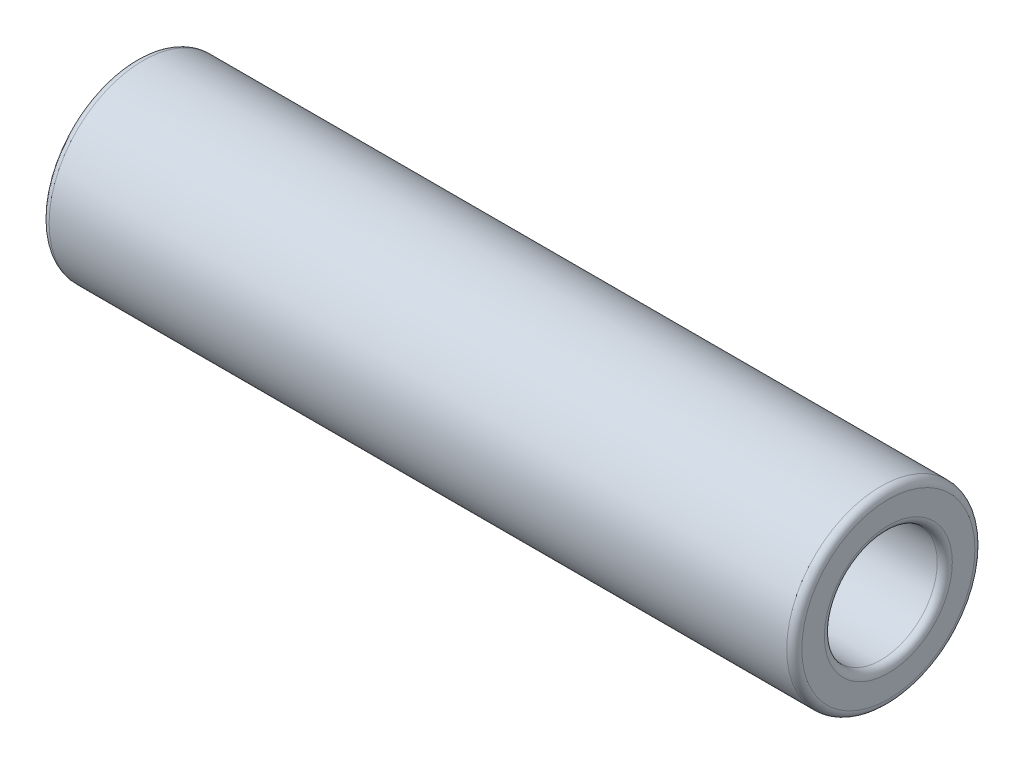
ISO-10303-21;
HEADER;
FILE_DESCRIPTION(('STEP AP214'),'2;1');
FILE_NAME('part.step','',(''),(''),'','','');
FILE_SCHEMA(('AUTOMOTIVE_DESIGN { 1 0 10303 214 1 1 1 1 }'));
ENDSEC;
DATA;
#1=APPLICATION_CONTEXT('core data for automotive mechanical design processes');
#2=APPLICATION_PROTOCOL_DEFINITION('international standard','automotive_design',2000,#1);
#3=PRODUCT_CONTEXT('',#1,'mechanical');
#4=PRODUCT('Part','Part','',(#3));
#5=PRODUCT_RELATED_PRODUCT_CATEGORY('part','',(#4));
#6=PRODUCT_DEFINITION_FORMATION('','',#4);
#7=PRODUCT_DEFINITION_CONTEXT('part definition',#1,'design');
#8=PRODUCT_DEFINITION('design','',#6,#7);
#9=PRODUCT_DEFINITION_SHAPE('','',#8);
#10=(LENGTH_UNIT() NAMED_UNIT(*) SI_UNIT(.MILLI.,.METRE.));
#11=(NAMED_UNIT(*) PLANE_ANGLE_UNIT() SI_UNIT($,.RADIAN.));
#12=(NAMED_UNIT(*) SI_UNIT($,.STERADIAN.) SOLID_ANGLE_UNIT());
#13=UNCERTAINTY_MEASURE_WITH_UNIT(LENGTH_MEASURE(1.E-05),#10,'distance_accuracy_value','');
#14=(GEOMETRIC_REPRESENTATION_CONTEXT(3) GLOBAL_UNCERTAINTY_ASSIGNED_CONTEXT((#13)) GLOBAL_UNIT_ASSIGNED_CONTEXT((#10,
#11,#12)) REPRESENTATION_CONTEXT('',''));
#15=CARTESIAN_POINT('',(0.,0.,0.));
#16=DIRECTION('',(0.,0.,1.));
#17=DIRECTION('',(1.,0.,0.));
#18=AXIS2_PLACEMENT_3D('',#15,#16,#17);
#19=CARTESIAN_POINT('',(50.,0.,0.));
#20=DIRECTION('',(1.,0.,0.));
#21=DIRECTION('',(0.,0.,-1.));
#22=AXIS2_PLACEMENT_3D('',#19,#20,#21);
#23=PLANE('',#22);
#24=CARTESIAN_POINT('',(50.,0.,0.));
#25=DIRECTION('',(1.,0.,0.));
#26=DIRECTION('',(0.,0.,-1.));
#27=AXIS2_PLACEMENT_3D('',#24,#25,#26);
#28=CIRCLE('',#27,4.25);
#29=CARTESIAN_POINT('',(50.,0.,-4.25));
#30=VERTEX_POINT('',#29);
#31=EDGE_CURVE('E50',#30,#30,#28,.F.);
#32=ORIENTED_EDGE('',*,*,#31,.T.);
#33=EDGE_LOOP('',(#32));
#34=FACE_BOUND('',#33,.T.);
#35=CARTESIAN_POINT('',(50.,0.,0.));
#36=DIRECTION('',(1.,0.,0.));
#37=DIRECTION('',(0.,0.,-1.));
#38=AXIS2_PLACEMENT_3D('',#35,#36,#37);
#39=CIRCLE('',#38,5.75);
#40=CARTESIAN_POINT('',(50.,0.,-5.75));
#41=VERTEX_POINT('',#40);
#42=EDGE_CURVE('E53',#41,#41,#39,.T.);
#43=ORIENTED_EDGE('',*,*,#42,.T.);
#44=EDGE_LOOP('',(#43));
#45=FACE_BOUND('',#44,.T.);
#46=ADVANCED_FACE('F30',(#34,#45),#23,.T.);
#47=CARTESIAN_POINT('',(0.,0.,0.));
#48=DIRECTION('',(1.,0.,0.));
#49=DIRECTION('',(0.,0.,-1.));
#50=AXIS2_PLACEMENT_3D('',#47,#48,#49);
#51=PLANE('',#50);
#52=CARTESIAN_POINT('',(0.,0.,0.));
#53=DIRECTION('',(1.,0.,0.));
#54=DIRECTION('',(0.,0.,-1.));
#55=AXIS2_PLACEMENT_3D('',#52,#53,#54);
#56=CIRCLE('',#55,4.25);
#57=CARTESIAN_POINT('',(0.,0.,-4.25));
#58=VERTEX_POINT('',#57);
#59=EDGE_CURVE('E10',#58,#58,#56,.T.);
#60=ORIENTED_EDGE('',*,*,#59,.T.);
#61=EDGE_LOOP('',(#60));
#62=FACE_BOUND('',#61,.T.);
#63=CARTESIAN_POINT('',(0.,0.,0.));
#64=DIRECTION('',(1.,0.,0.));
#65=DIRECTION('',(0.,0.,-1.));
#66=AXIS2_PLACEMENT_3D('',#63,#64,#65);
#67=CIRCLE('',#66,5.75);
#68=CARTESIAN_POINT('',(0.,0.,-5.75));
#69=VERTEX_POINT('',#68);
#70=EDGE_CURVE('E37',#69,#69,#67,.F.);
#71=ORIENTED_EDGE('',*,*,#70,.T.);
#72=EDGE_LOOP('',(#71));
#73=FACE_BOUND('',#72,.T.);
#74=ADVANCED_FACE('F78',(#62,#73),#51,.F.);
#75=CARTESIAN_POINT('',(50.,0.,0.));
#76=DIRECTION('',(-1.,0.,0.));
#77=DIRECTION('',(0.,0.,1.));
#78=AXIS2_PLACEMENT_3D('',#75,#76,#77);
#79=CYLINDRICAL_SURFACE('',#78,6.25);
#80=CARTESIAN_POINT('',(49.5,0.,0.));
#81=DIRECTION('',(1.,0.,0.));
#82=DIRECTION('',(0.,0.,-1.));
#83=AXIS2_PLACEMENT_3D('',#80,#81,#82);
#84=CIRCLE('',#83,6.25);
#85=CARTESIAN_POINT('',(49.5,0.,-6.25));
#86=VERTEX_POINT('',#85);
#87=EDGE_CURVE('E41',#86,#86,#84,.F.);
#88=ORIENTED_EDGE('',*,*,#87,.T.);
#89=EDGE_LOOP('',(#88));
#90=FACE_BOUND('',#89,.T.);
#91=CARTESIAN_POINT('',(0.5,0.,0.));
#92=DIRECTION('',(1.,0.,0.));
#93=DIRECTION('',(0.,0.,-1.));
#94=AXIS2_PLACEMENT_3D('',#91,#92,#93);
#95=CIRCLE('',#94,6.25);
#96=CARTESIAN_POINT('',(0.5,0.,-6.25));
#97=VERTEX_POINT('',#96);
#98=EDGE_CURVE('E45',#97,#97,#95,.T.);
#99=ORIENTED_EDGE('',*,*,#98,.T.);
#100=EDGE_LOOP('',(#99));
#101=FACE_BOUND('',#100,.T.);
#102=ADVANCED_FACE('F84',(#90,#101),#79,.T.);
#103=CARTESIAN_POINT('',(50.,0.,0.));
#104=DIRECTION('',(-1.,0.,0.));
#105=DIRECTION('',(0.,0.,1.));
#106=AXIS2_PLACEMENT_3D('',#103,#104,#105);
#107=CYLINDRICAL_SURFACE('',#106,3.75);
#108=CARTESIAN_POINT('',(49.5,0.,0.));
#109=DIRECTION('',(1.,0.,0.));
#110=DIRECTION('',(0.,0.,-1.));
#111=AXIS2_PLACEMENT_3D('',#108,#109,#110);
#112=CIRCLE('',#111,3.75);
#113=CARTESIAN_POINT('',(49.5,0.,-3.75));
#114=VERTEX_POINT('',#113);
#115=EDGE_CURVE('E56',#114,#114,#112,.T.);
#116=ORIENTED_EDGE('',*,*,#115,.T.);
#117=EDGE_LOOP('',(#116));
#118=FACE_BOUND('',#117,.T.);
#119=CARTESIAN_POINT('',(0.5,0.,0.));
#120=DIRECTION('',(1.,0.,0.));
#121=DIRECTION('',(0.,0.,-1.));
#122=AXIS2_PLACEMENT_3D('',#119,#120,#121);
#123=CIRCLE('',#122,3.75);
#124=CARTESIAN_POINT('',(0.5,0.,-3.75));
#125=VERTEX_POINT('',#124);
#126=EDGE_CURVE('E59',#125,#125,#123,.F.);
#127=ORIENTED_EDGE('',*,*,#126,.T.);
#128=EDGE_LOOP('',(#127));
#129=FACE_BOUND('',#128,.T.);
#130=ADVANCED_FACE('F63',(#118,#129),#107,.F.);
#131=CARTESIAN_POINT('',(49.5,0.,0.));
#132=DIRECTION('',(1.,0.,0.));
#133=DIRECTION('',(0.,0.,-1.));
#134=AXIS2_PLACEMENT_3D('',#131,#132,#133);
#135=TOROIDAL_SURFACE('',#134,4.25,0.5);
#136=ORIENTED_EDGE('',*,*,#31,.F.);
#137=EDGE_LOOP('',(#136));
#138=FACE_BOUND('',#137,.T.);
#139=ORIENTED_EDGE('',*,*,#115,.F.);
#140=EDGE_LOOP('',(#139));
#141=FACE_BOUND('',#140,.T.);
#142=ADVANCED_FACE('F74',(#138,#141),#135,.T.);
#143=CARTESIAN_POINT('',(49.5,0.,0.));
#144=DIRECTION('',(1.,0.,0.));
#145=DIRECTION('',(0.,0.,-1.));
#146=AXIS2_PLACEMENT_3D('',#143,#144,#145);
#147=TOROIDAL_SURFACE('',#146,5.75,0.5);
#148=ORIENTED_EDGE('',*,*,#87,.F.);
#149=EDGE_LOOP('',(#148));
#150=FACE_BOUND('',#149,.T.);
#151=ORIENTED_EDGE('',*,*,#42,.F.);
#152=EDGE_LOOP('',(#151));
#153=FACE_BOUND('',#152,.T.);
#154=ADVANCED_FACE('F68',(#150,#153),#147,.T.);
#155=CARTESIAN_POINT('',(0.5,0.,0.));
#156=DIRECTION('',(1.,0.,0.));
#157=DIRECTION('',(0.,0.,-1.));
#158=AXIS2_PLACEMENT_3D('',#155,#156,#157);
#159=TOROIDAL_SURFACE('',#158,4.25,0.5);
#160=ORIENTED_EDGE('',*,*,#126,.F.);
#161=EDGE_LOOP('',(#160));
#162=FACE_BOUND('',#161,.T.);
#163=ORIENTED_EDGE('',*,*,#59,.F.);
#164=EDGE_LOOP('',(#163));
#165=FACE_BOUND('',#164,.T.);
#166=ADVANCED_FACE('F65',(#162,#165),#159,.T.);
#167=CARTESIAN_POINT('',(0.5,0.,0.));
#168=DIRECTION('',(1.,0.,0.));
#169=DIRECTION('',(0.,0.,-1.));
#170=AXIS2_PLACEMENT_3D('',#167,#168,#169);
#171=TOROIDAL_SURFACE('',#170,5.75,0.5);
#172=ORIENTED_EDGE('',*,*,#70,.F.);
#173=EDGE_LOOP('',(#172));
#174=FACE_BOUND('',#173,.T.);
#175=ORIENTED_EDGE('',*,*,#98,.F.);
#176=EDGE_LOOP('',(#175));
#177=FACE_BOUND('',#176,.T.);
#178=ADVANCED_FACE('F32',(#174,#177),#171,.T.);
#179=CLOSED_SHELL('',(#46,#74,#102,#130,#142,#154,#166,#178));
#180=MANIFOLD_SOLID_BREP('B2',#179);
#181=ADVANCED_BREP_SHAPE_REPRESENTATION('',(#18,#180),#14);
#182=SHAPE_DEFINITION_REPRESENTATION(#9,#181);
ENDSEC;
END-ISO-10303-21;
